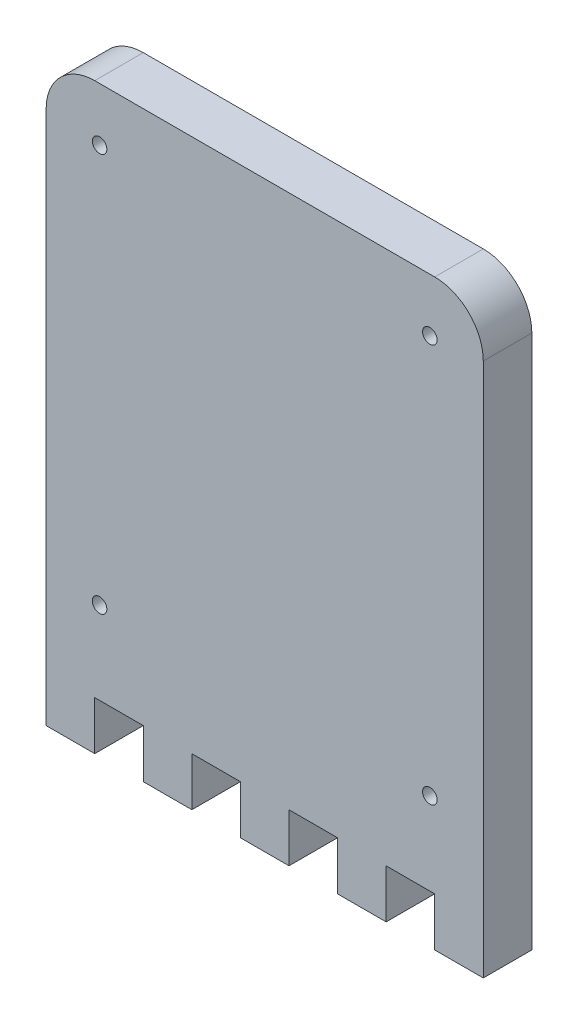
ISO-10303-21;
HEADER;
FILE_DESCRIPTION(('STEP AP214'),'2;1');
FILE_NAME('part.step','',(''),(''),'','','');
FILE_SCHEMA(('AUTOMOTIVE_DESIGN { 1 0 10303 214 1 1 1 1 }'));
ENDSEC;
DATA;
#1=APPLICATION_CONTEXT('core data for automotive mechanical design processes');
#2=APPLICATION_PROTOCOL_DEFINITION('international standard','automotive_design',2000,#1);
#3=PRODUCT_CONTEXT('',#1,'mechanical');
#4=PRODUCT('Part','Part','',(#3));
#5=PRODUCT_RELATED_PRODUCT_CATEGORY('part','',(#4));
#6=PRODUCT_DEFINITION_FORMATION('','',#4);
#7=PRODUCT_DEFINITION_CONTEXT('part definition',#1,'design');
#8=PRODUCT_DEFINITION('design','',#6,#7);
#9=PRODUCT_DEFINITION_SHAPE('','',#8);
#10=(LENGTH_UNIT() NAMED_UNIT(*) SI_UNIT(.MILLI.,.METRE.));
#11=(NAMED_UNIT(*) PLANE_ANGLE_UNIT() SI_UNIT($,.RADIAN.));
#12=(NAMED_UNIT(*) SI_UNIT($,.STERADIAN.) SOLID_ANGLE_UNIT());
#13=UNCERTAINTY_MEASURE_WITH_UNIT(LENGTH_MEASURE(1.E-05),#10,'distance_accuracy_value','');
#14=(GEOMETRIC_REPRESENTATION_CONTEXT(3) GLOBAL_UNCERTAINTY_ASSIGNED_CONTEXT((#13)) GLOBAL_UNIT_ASSIGNED_CONTEXT((#10,
#11,#12)) REPRESENTATION_CONTEXT('',''));
#15=CARTESIAN_POINT('',(0.,0.,0.));
#16=DIRECTION('',(0.,0.,1.));
#17=DIRECTION('',(1.,0.,0.));
#18=AXIS2_PLACEMENT_3D('',#15,#16,#17);
#19=CARTESIAN_POINT('',(45.,-55.,5.));
#20=DIRECTION('',(-1.,0.,0.));
#21=DIRECTION('',(0.,-1.,0.));
#22=AXIS2_PLACEMENT_3D('',#19,#20,#21);
#23=PLANE('',#22);
#24=DIRECTION('',(0.,1.,0.));
#25=VECTOR('',#24,1.);
#26=CARTESIAN_POINT('',(45.,-55.,-5.));
#27=LINE('',#26,#25);
#28=CARTESIAN_POINT('',(44.9999999999999,-65.,-5.));
#29=VERTEX_POINT('',#28);
#30=CARTESIAN_POINT('',(45.,45.,-5.));
#31=VERTEX_POINT('',#30);
#32=EDGE_CURVE('E134',#29,#31,#27,.T.);
#33=ORIENTED_EDGE('',*,*,#32,.T.);
#34=DIRECTION('',(0.,0.,-1.));
#35=VECTOR('',#34,1.);
#36=CARTESIAN_POINT('',(45.,45.,5.));
#37=LINE('',#36,#35);
#38=CARTESIAN_POINT('',(45.,45.,5.));
#39=VERTEX_POINT('',#38);
#40=EDGE_CURVE('E11',#39,#31,#37,.T.);
#41=ORIENTED_EDGE('',*,*,#40,.F.);
#42=DIRECTION('',(0.,1.,0.));
#43=VECTOR('',#42,1.);
#44=CARTESIAN_POINT('',(45.,-55.,5.));
#45=LINE('',#44,#43);
#46=CARTESIAN_POINT('',(44.9999999999999,-65.,5.));
#47=VERTEX_POINT('',#46);
#48=EDGE_CURVE('E140',#47,#39,#45,.T.);
#49=ORIENTED_EDGE('',*,*,#48,.F.);
#50=DIRECTION('',(0.,0.,-1.));
#51=VECTOR('',#50,1.);
#52=CARTESIAN_POINT('',(44.9999999999999,-65.,5.));
#53=LINE('',#52,#51);
#54=EDGE_CURVE('E220',#47,#29,#53,.T.);
#55=ORIENTED_EDGE('',*,*,#54,.T.);
#56=EDGE_LOOP('',(#33,#41,#49,#55));
#57=FACE_BOUND('',#56,.T.);
#58=ADVANCED_FACE('F39',(#57),#23,.F.);
#59=CARTESIAN_POINT('',(35.,45.,5.));
#60=DIRECTION('',(0.,0.,-1.));
#61=DIRECTION('',(-1.,0.,0.));
#62=AXIS2_PLACEMENT_3D('',#59,#60,#61);
#63=CYLINDRICAL_SURFACE('',#62,9.99999999999999);
#64=CARTESIAN_POINT('',(35.,45.,-5.));
#65=DIRECTION('',(0.,0.,1.));
#66=DIRECTION('',(1.,0.,0.));
#67=AXIS2_PLACEMENT_3D('',#64,#65,#66);
#68=CIRCLE('',#67,9.99999999999999);
#69=CARTESIAN_POINT('',(35.,55.,-5.));
#70=VERTEX_POINT('',#69);
#71=EDGE_CURVE('E226',#31,#70,#68,.T.);
#72=ORIENTED_EDGE('',*,*,#71,.T.);
#73=DIRECTION('',(0.,0.,-1.));
#74=VECTOR('',#73,1.);
#75=CARTESIAN_POINT('',(35.,55.,5.));
#76=LINE('',#75,#74);
#77=CARTESIAN_POINT('',(35.,55.,5.));
#78=VERTEX_POINT('',#77);
#79=EDGE_CURVE('E48',#78,#70,#76,.T.);
#80=ORIENTED_EDGE('',*,*,#79,.F.);
#81=CARTESIAN_POINT('',(35.,45.,5.));
#82=DIRECTION('',(0.,0.,1.));
#83=DIRECTION('',(1.,0.,0.));
#84=AXIS2_PLACEMENT_3D('',#81,#82,#83);
#85=CIRCLE('',#84,9.99999999999999);
#86=EDGE_CURVE('E443',#39,#78,#85,.T.);
#87=ORIENTED_EDGE('',*,*,#86,.F.);
#88=ORIENTED_EDGE('',*,*,#40,.T.);
#89=EDGE_LOOP('',(#72,#80,#87,#88));
#90=FACE_BOUND('',#89,.T.);
#91=ADVANCED_FACE('F450',(#90),#63,.T.);
#92=CARTESIAN_POINT('',(35.,55.,5.));
#93=DIRECTION('',(0.,-1.,0.));
#94=DIRECTION('',(1.,0.,0.));
#95=AXIS2_PLACEMENT_3D('',#92,#93,#94);
#96=PLANE('',#95);
#97=DIRECTION('',(-1.,0.,0.));
#98=VECTOR('',#97,1.);
#99=CARTESIAN_POINT('',(35.,55.,-5.));
#100=LINE('',#99,#98);
#101=CARTESIAN_POINT('',(-35.,55.,-5.));
#102=VERTEX_POINT('',#101);
#103=EDGE_CURVE('E230',#70,#102,#100,.T.);
#104=ORIENTED_EDGE('',*,*,#103,.T.);
#105=DIRECTION('',(0.,0.,-1.));
#106=VECTOR('',#105,1.);
#107=CARTESIAN_POINT('',(-35.,55.,5.));
#108=LINE('',#107,#106);
#109=CARTESIAN_POINT('',(-35.,55.,5.));
#110=VERTEX_POINT('',#109);
#111=EDGE_CURVE('E356',#110,#102,#108,.T.);
#112=ORIENTED_EDGE('',*,*,#111,.F.);
#113=DIRECTION('',(-1.,0.,0.));
#114=VECTOR('',#113,1.);
#115=CARTESIAN_POINT('',(35.,55.,5.));
#116=LINE('',#115,#114);
#117=EDGE_CURVE('E367',#78,#110,#116,.T.);
#118=ORIENTED_EDGE('',*,*,#117,.F.);
#119=ORIENTED_EDGE('',*,*,#79,.T.);
#120=EDGE_LOOP('',(#104,#112,#118,#119));
#121=FACE_BOUND('',#120,.T.);
#122=ADVANCED_FACE('F365',(#121),#96,.F.);
#123=CARTESIAN_POINT('',(-35.,45.,5.));
#124=DIRECTION('',(0.,0.,-1.));
#125=DIRECTION('',(-1.,0.,0.));
#126=AXIS2_PLACEMENT_3D('',#123,#124,#125);
#127=CYLINDRICAL_SURFACE('',#126,10.);
#128=CARTESIAN_POINT('',(-35.,45.,-5.));
#129=DIRECTION('',(0.,0.,1.));
#130=DIRECTION('',(1.,0.,0.));
#131=AXIS2_PLACEMENT_3D('',#128,#129,#130);
#132=CIRCLE('',#131,10.);
#133=CARTESIAN_POINT('',(-45.,45.,-5.));
#134=VERTEX_POINT('',#133);
#135=EDGE_CURVE('E233',#102,#134,#132,.T.);
#136=ORIENTED_EDGE('',*,*,#135,.T.);
#137=DIRECTION('',(0.,0.,-1.));
#138=VECTOR('',#137,1.);
#139=CARTESIAN_POINT('',(-45.,45.,5.));
#140=LINE('',#139,#138);
#141=CARTESIAN_POINT('',(-45.,45.,5.));
#142=VERTEX_POINT('',#141);
#143=EDGE_CURVE('E352',#142,#134,#140,.T.);
#144=ORIENTED_EDGE('',*,*,#143,.F.);
#145=CARTESIAN_POINT('',(-35.,45.,5.));
#146=DIRECTION('',(0.,0.,1.));
#147=DIRECTION('',(1.,0.,0.));
#148=AXIS2_PLACEMENT_3D('',#145,#146,#147);
#149=CIRCLE('',#148,10.);
#150=EDGE_CURVE('E385',#110,#142,#149,.T.);
#151=ORIENTED_EDGE('',*,*,#150,.F.);
#152=ORIENTED_EDGE('',*,*,#111,.T.);
#153=EDGE_LOOP('',(#136,#144,#151,#152));
#154=FACE_BOUND('',#153,.T.);
#155=ADVANCED_FACE('F375',(#154),#127,.T.);
#156=CARTESIAN_POINT('',(-45.,-55.,5.));
#157=DIRECTION('',(1.,0.,0.));
#158=DIRECTION('',(0.,0.,-1.));
#159=AXIS2_PLACEMENT_3D('',#156,#157,#158);
#160=PLANE('',#159);
#161=DIRECTION('',(0.,-1.,0.));
#162=VECTOR('',#161,1.);
#163=CARTESIAN_POINT('',(-45.,-55.,-5.));
#164=LINE('',#163,#162);
#165=CARTESIAN_POINT('',(-45.,-65.,-5.));
#166=VERTEX_POINT('',#165);
#167=EDGE_CURVE('E237',#134,#166,#164,.T.);
#168=ORIENTED_EDGE('',*,*,#167,.T.);
#169=DIRECTION('',(0.,0.,-1.));
#170=VECTOR('',#169,1.);
#171=CARTESIAN_POINT('',(-45.,-65.,5.));
#172=LINE('',#171,#170);
#173=CARTESIAN_POINT('',(-45.,-65.,5.));
#174=VERTEX_POINT('',#173);
#175=EDGE_CURVE('E348',#174,#166,#172,.T.);
#176=ORIENTED_EDGE('',*,*,#175,.F.);
#177=DIRECTION('',(0.,-1.,0.));
#178=VECTOR('',#177,1.);
#179=CARTESIAN_POINT('',(-45.,-55.,5.));
#180=LINE('',#179,#178);
#181=EDGE_CURVE('E381',#142,#174,#180,.T.);
#182=ORIENTED_EDGE('',*,*,#181,.F.);
#183=ORIENTED_EDGE('',*,*,#143,.T.);
#184=EDGE_LOOP('',(#168,#176,#182,#183));
#185=FACE_BOUND('',#184,.T.);
#186=ADVANCED_FACE('F379',(#185),#160,.F.);
#187=CARTESIAN_POINT('',(-45.,-65.,5.));
#188=DIRECTION('',(0.,1.,0.));
#189=DIRECTION('',(0.,0.,1.));
#190=AXIS2_PLACEMENT_3D('',#187,#188,#189);
#191=PLANE('',#190);
#192=DIRECTION('',(1.,0.,0.));
#193=VECTOR('',#192,1.);
#194=CARTESIAN_POINT('',(-45.,-65.,-5.));
#195=LINE('',#194,#193);
#196=CARTESIAN_POINT('',(-35.,-65.,-5.));
#197=VERTEX_POINT('',#196);
#198=EDGE_CURVE('E240',#166,#197,#195,.T.);
#199=ORIENTED_EDGE('',*,*,#198,.T.);
#200=DIRECTION('',(0.,0.,-1.));
#201=VECTOR('',#200,1.);
#202=CARTESIAN_POINT('',(-35.,-65.,5.));
#203=LINE('',#202,#201);
#204=CARTESIAN_POINT('',(-35.,-65.,5.));
#205=VERTEX_POINT('',#204);
#206=EDGE_CURVE('E344',#205,#197,#203,.T.);
#207=ORIENTED_EDGE('',*,*,#206,.F.);
#208=DIRECTION('',(1.,0.,0.));
#209=VECTOR('',#208,1.);
#210=CARTESIAN_POINT('',(-45.,-65.,5.));
#211=LINE('',#210,#209);
#212=EDGE_CURVE('E384',#174,#205,#211,.T.);
#213=ORIENTED_EDGE('',*,*,#212,.F.);
#214=ORIENTED_EDGE('',*,*,#175,.T.);
#215=EDGE_LOOP('',(#199,#207,#213,#214));
#216=FACE_BOUND('',#215,.T.);
#217=ADVANCED_FACE('F462',(#216),#191,.F.);
#218=CARTESIAN_POINT('',(-35.,-55.,5.));
#219=DIRECTION('',(-1.,0.,0.));
#220=DIRECTION('',(0.,0.,1.));
#221=AXIS2_PLACEMENT_3D('',#218,#219,#220);
#222=PLANE('',#221);
#223=DIRECTION('',(0.,1.,0.));
#224=VECTOR('',#223,1.);
#225=CARTESIAN_POINT('',(-35.,-55.,-5.));
#226=LINE('',#225,#224);
#227=CARTESIAN_POINT('',(-35.,-55.,-5.));
#228=VERTEX_POINT('',#227);
#229=EDGE_CURVE('E243',#197,#228,#226,.T.);
#230=ORIENTED_EDGE('',*,*,#229,.T.);
#231=DIRECTION('',(0.,0.,-1.));
#232=VECTOR('',#231,1.);
#233=CARTESIAN_POINT('',(-35.,-55.,5.));
#234=LINE('',#233,#232);
#235=CARTESIAN_POINT('',(-35.,-55.,5.));
#236=VERTEX_POINT('',#235);
#237=EDGE_CURVE('E340',#236,#228,#234,.T.);
#238=ORIENTED_EDGE('',*,*,#237,.F.);
#239=DIRECTION('',(0.,1.,0.));
#240=VECTOR('',#239,1.);
#241=CARTESIAN_POINT('',(-35.,-55.,5.));
#242=LINE('',#241,#240);
#243=EDGE_CURVE('E389',#205,#236,#242,.T.);
#244=ORIENTED_EDGE('',*,*,#243,.F.);
#245=ORIENTED_EDGE('',*,*,#206,.T.);
#246=EDGE_LOOP('',(#230,#238,#244,#245));
#247=FACE_BOUND('',#246,.T.);
#248=ADVANCED_FACE('F465',(#247),#222,.F.);
#249=CARTESIAN_POINT('',(-25.,-55.,5.));
#250=DIRECTION('',(0.,1.,0.));
#251=DIRECTION('',(-1.,0.,0.));
#252=AXIS2_PLACEMENT_3D('',#249,#250,#251);
#253=PLANE('',#252);
#254=DIRECTION('',(1.,0.,0.));
#255=VECTOR('',#254,1.);
#256=CARTESIAN_POINT('',(-25.,-55.,-5.));
#257=LINE('',#256,#255);
#258=CARTESIAN_POINT('',(-25.,-55.,-5.));
#259=VERTEX_POINT('',#258);
#260=EDGE_CURVE('E246',#228,#259,#257,.T.);
#261=ORIENTED_EDGE('',*,*,#260,.T.);
#262=DIRECTION('',(0.,0.,-1.));
#263=VECTOR('',#262,1.);
#264=CARTESIAN_POINT('',(-25.,-55.,5.));
#265=LINE('',#264,#263);
#266=CARTESIAN_POINT('',(-25.,-55.,5.));
#267=VERTEX_POINT('',#266);
#268=EDGE_CURVE('E336',#267,#259,#265,.T.);
#269=ORIENTED_EDGE('',*,*,#268,.F.);
#270=DIRECTION('',(1.,0.,0.));
#271=VECTOR('',#270,1.);
#272=CARTESIAN_POINT('',(-25.,-55.,5.));
#273=LINE('',#272,#271);
#274=EDGE_CURVE('E396',#236,#267,#273,.T.);
#275=ORIENTED_EDGE('',*,*,#274,.F.);
#276=ORIENTED_EDGE('',*,*,#237,.T.);
#277=EDGE_LOOP('',(#261,#269,#275,#276));
#278=FACE_BOUND('',#277,.T.);
#279=ADVANCED_FACE('F469',(#278),#253,.F.);
#280=CARTESIAN_POINT('',(-25.,-55.,5.));
#281=DIRECTION('',(1.,0.,0.));
#282=DIRECTION('',(0.,1.,0.));
#283=AXIS2_PLACEMENT_3D('',#280,#281,#282);
#284=PLANE('',#283);
#285=DIRECTION('',(0.,-1.,0.));
#286=VECTOR('',#285,1.);
#287=CARTESIAN_POINT('',(-25.,-55.,-5.));
#288=LINE('',#287,#286);
#289=CARTESIAN_POINT('',(-25.,-65.,-5.));
#290=VERTEX_POINT('',#289);
#291=EDGE_CURVE('E249',#259,#290,#288,.T.);
#292=ORIENTED_EDGE('',*,*,#291,.T.);
#293=DIRECTION('',(0.,0.,-1.));
#294=VECTOR('',#293,1.);
#295=CARTESIAN_POINT('',(-25.,-65.,5.));
#296=LINE('',#295,#294);
#297=CARTESIAN_POINT('',(-25.,-65.,5.));
#298=VERTEX_POINT('',#297);
#299=EDGE_CURVE('E332',#298,#290,#296,.T.);
#300=ORIENTED_EDGE('',*,*,#299,.F.);
#301=DIRECTION('',(0.,-1.,0.));
#302=VECTOR('',#301,1.);
#303=CARTESIAN_POINT('',(-25.,-55.,5.));
#304=LINE('',#303,#302);
#305=EDGE_CURVE('E399',#267,#298,#304,.T.);
#306=ORIENTED_EDGE('',*,*,#305,.F.);
#307=ORIENTED_EDGE('',*,*,#268,.T.);
#308=EDGE_LOOP('',(#292,#300,#306,#307));
#309=FACE_BOUND('',#308,.T.);
#310=ADVANCED_FACE('F473',(#309),#284,.F.);
#311=CARTESIAN_POINT('',(-25.,-65.,5.));
#312=DIRECTION('',(0.,1.,0.));
#313=DIRECTION('',(0.,0.,1.));
#314=AXIS2_PLACEMENT_3D('',#311,#312,#313);
#315=PLANE('',#314);
#316=DIRECTION('',(1.,0.,0.));
#317=VECTOR('',#316,1.);
#318=CARTESIAN_POINT('',(-25.,-65.,-5.));
#319=LINE('',#318,#317);
#320=CARTESIAN_POINT('',(-15.,-65.,-5.));
#321=VERTEX_POINT('',#320);
#322=EDGE_CURVE('E252',#290,#321,#319,.T.);
#323=ORIENTED_EDGE('',*,*,#322,.T.);
#324=DIRECTION('',(0.,0.,-1.));
#325=VECTOR('',#324,1.);
#326=CARTESIAN_POINT('',(-15.,-65.,5.));
#327=LINE('',#326,#325);
#328=CARTESIAN_POINT('',(-15.,-65.,5.));
#329=VERTEX_POINT('',#328);
#330=EDGE_CURVE('E328',#329,#321,#327,.T.);
#331=ORIENTED_EDGE('',*,*,#330,.F.);
#332=DIRECTION('',(1.,0.,0.));
#333=VECTOR('',#332,1.);
#334=CARTESIAN_POINT('',(-25.,-65.,5.));
#335=LINE('',#334,#333);
#336=EDGE_CURVE('E402',#298,#329,#335,.T.);
#337=ORIENTED_EDGE('',*,*,#336,.F.);
#338=ORIENTED_EDGE('',*,*,#299,.T.);
#339=EDGE_LOOP('',(#323,#331,#337,#338));
#340=FACE_BOUND('',#339,.T.);
#341=ADVANCED_FACE('F477',(#340),#315,.F.);
#342=CARTESIAN_POINT('',(-15.,-55.,5.));
#343=DIRECTION('',(-1.,0.,0.));
#344=DIRECTION('',(0.,-1.,0.));
#345=AXIS2_PLACEMENT_3D('',#342,#343,#344);
#346=PLANE('',#345);
#347=DIRECTION('',(0.,1.,0.));
#348=VECTOR('',#347,1.);
#349=CARTESIAN_POINT('',(-15.,-55.,-5.));
#350=LINE('',#349,#348);
#351=CARTESIAN_POINT('',(-15.,-55.,-5.));
#352=VERTEX_POINT('',#351);
#353=EDGE_CURVE('E255',#321,#352,#350,.T.);
#354=ORIENTED_EDGE('',*,*,#353,.T.);
#355=DIRECTION('',(0.,0.,-1.));
#356=VECTOR('',#355,1.);
#357=CARTESIAN_POINT('',(-15.,-55.,5.));
#358=LINE('',#357,#356);
#359=CARTESIAN_POINT('',(-15.,-55.,5.));
#360=VERTEX_POINT('',#359);
#361=EDGE_CURVE('E324',#360,#352,#358,.T.);
#362=ORIENTED_EDGE('',*,*,#361,.F.);
#363=DIRECTION('',(0.,1.,0.));
#364=VECTOR('',#363,1.);
#365=CARTESIAN_POINT('',(-15.,-55.,5.));
#366=LINE('',#365,#364);
#367=EDGE_CURVE('E405',#329,#360,#366,.T.);
#368=ORIENTED_EDGE('',*,*,#367,.F.);
#369=ORIENTED_EDGE('',*,*,#330,.T.);
#370=EDGE_LOOP('',(#354,#362,#368,#369));
#371=FACE_BOUND('',#370,.T.);
#372=ADVANCED_FACE('F481',(#371),#346,.F.);
#373=CARTESIAN_POINT('',(-5.00000000000004,-55.,5.));
#374=DIRECTION('',(0.,1.,0.));
#375=DIRECTION('',(-1.,0.,0.));
#376=AXIS2_PLACEMENT_3D('',#373,#374,#375);
#377=PLANE('',#376);
#378=DIRECTION('',(1.,0.,0.));
#379=VECTOR('',#378,1.);
#380=CARTESIAN_POINT('',(-5.00000000000004,-55.,-5.));
#381=LINE('',#380,#379);
#382=CARTESIAN_POINT('',(-5.00000000000004,-55.,-5.));
#383=VERTEX_POINT('',#382);
#384=EDGE_CURVE('E258',#352,#383,#381,.T.);
#385=ORIENTED_EDGE('',*,*,#384,.T.);
#386=DIRECTION('',(0.,0.,-1.));
#387=VECTOR('',#386,1.);
#388=CARTESIAN_POINT('',(-5.00000000000004,-55.,5.));
#389=LINE('',#388,#387);
#390=CARTESIAN_POINT('',(-5.00000000000004,-55.,5.));
#391=VERTEX_POINT('',#390);
#392=EDGE_CURVE('E320',#391,#383,#389,.T.);
#393=ORIENTED_EDGE('',*,*,#392,.F.);
#394=DIRECTION('',(1.,0.,0.));
#395=VECTOR('',#394,1.);
#396=CARTESIAN_POINT('',(-5.00000000000004,-55.,5.));
#397=LINE('',#396,#395);
#398=EDGE_CURVE('E408',#360,#391,#397,.T.);
#399=ORIENTED_EDGE('',*,*,#398,.F.);
#400=ORIENTED_EDGE('',*,*,#361,.T.);
#401=EDGE_LOOP('',(#385,#393,#399,#400));
#402=FACE_BOUND('',#401,.T.);
#403=ADVANCED_FACE('F485',(#402),#377,.F.);
#404=CARTESIAN_POINT('',(-5.00000000000004,-55.,5.));
#405=DIRECTION('',(1.,0.,0.));
#406=DIRECTION('',(0.,1.,0.));
#407=AXIS2_PLACEMENT_3D('',#404,#405,#406);
#408=PLANE('',#407);
#409=DIRECTION('',(0.,-1.,0.));
#410=VECTOR('',#409,1.);
#411=CARTESIAN_POINT('',(-5.00000000000004,-55.,-5.));
#412=LINE('',#411,#410);
#413=CARTESIAN_POINT('',(-5.00000000000003,-65.,-5.));
#414=VERTEX_POINT('',#413);
#415=EDGE_CURVE('E261',#383,#414,#412,.T.);
#416=ORIENTED_EDGE('',*,*,#415,.T.);
#417=DIRECTION('',(0.,0.,-1.));
#418=VECTOR('',#417,1.);
#419=CARTESIAN_POINT('',(-5.00000000000003,-65.,5.));
#420=LINE('',#419,#418);
#421=CARTESIAN_POINT('',(-5.00000000000003,-65.,5.));
#422=VERTEX_POINT('',#421);
#423=EDGE_CURVE('E316',#422,#414,#420,.T.);
#424=ORIENTED_EDGE('',*,*,#423,.F.);
#425=DIRECTION('',(0.,-1.,0.));
#426=VECTOR('',#425,1.);
#427=CARTESIAN_POINT('',(-5.00000000000004,-55.,5.));
#428=LINE('',#427,#426);
#429=EDGE_CURVE('E411',#391,#422,#428,.T.);
#430=ORIENTED_EDGE('',*,*,#429,.F.);
#431=ORIENTED_EDGE('',*,*,#392,.T.);
#432=EDGE_LOOP('',(#416,#424,#430,#431));
#433=FACE_BOUND('',#432,.T.);
#434=ADVANCED_FACE('F489',(#433),#408,.F.);
#435=CARTESIAN_POINT('',(-5.00000000000003,-65.,5.));
#436=DIRECTION('',(0.,1.,0.));
#437=DIRECTION('',(0.,0.,1.));
#438=AXIS2_PLACEMENT_3D('',#435,#436,#437);
#439=PLANE('',#438);
#440=DIRECTION('',(1.,0.,0.));
#441=VECTOR('',#440,1.);
#442=CARTESIAN_POINT('',(-5.00000000000003,-65.,-5.));
#443=LINE('',#442,#441);
#444=CARTESIAN_POINT('',(4.99999999999997,-65.,-5.));
#445=VERTEX_POINT('',#444);
#446=EDGE_CURVE('E264',#414,#445,#443,.T.);
#447=ORIENTED_EDGE('',*,*,#446,.T.);
#448=DIRECTION('',(0.,0.,-1.));
#449=VECTOR('',#448,1.);
#450=CARTESIAN_POINT('',(4.99999999999997,-65.,5.));
#451=LINE('',#450,#449);
#452=CARTESIAN_POINT('',(4.99999999999997,-65.,5.));
#453=VERTEX_POINT('',#452);
#454=EDGE_CURVE('E312',#453,#445,#451,.T.);
#455=ORIENTED_EDGE('',*,*,#454,.F.);
#456=DIRECTION('',(1.,0.,0.));
#457=VECTOR('',#456,1.);
#458=CARTESIAN_POINT('',(-5.00000000000003,-65.,5.));
#459=LINE('',#458,#457);
#460=EDGE_CURVE('E414',#422,#453,#459,.T.);
#461=ORIENTED_EDGE('',*,*,#460,.F.);
#462=ORIENTED_EDGE('',*,*,#423,.T.);
#463=EDGE_LOOP('',(#447,#455,#461,#462));
#464=FACE_BOUND('',#463,.T.);
#465=ADVANCED_FACE('F493',(#464),#439,.F.);
#466=CARTESIAN_POINT('',(4.99999999999996,-55.,5.));
#467=DIRECTION('',(-1.,0.,0.));
#468=DIRECTION('',(0.,-1.,0.));
#469=AXIS2_PLACEMENT_3D('',#466,#467,#468);
#470=PLANE('',#469);
#471=DIRECTION('',(0.,1.,0.));
#472=VECTOR('',#471,1.);
#473=CARTESIAN_POINT('',(4.99999999999996,-55.,-5.));
#474=LINE('',#473,#472);
#475=CARTESIAN_POINT('',(4.99999999999996,-55.,-5.));
#476=VERTEX_POINT('',#475);
#477=EDGE_CURVE('E267',#445,#476,#474,.T.);
#478=ORIENTED_EDGE('',*,*,#477,.T.);
#479=DIRECTION('',(0.,0.,-1.));
#480=VECTOR('',#479,1.);
#481=CARTESIAN_POINT('',(4.99999999999996,-55.,5.));
#482=LINE('',#481,#480);
#483=CARTESIAN_POINT('',(4.99999999999996,-55.,5.));
#484=VERTEX_POINT('',#483);
#485=EDGE_CURVE('E308',#484,#476,#482,.T.);
#486=ORIENTED_EDGE('',*,*,#485,.F.);
#487=DIRECTION('',(0.,1.,0.));
#488=VECTOR('',#487,1.);
#489=CARTESIAN_POINT('',(4.99999999999996,-55.,5.));
#490=LINE('',#489,#488);
#491=EDGE_CURVE('E417',#453,#484,#490,.T.);
#492=ORIENTED_EDGE('',*,*,#491,.F.);
#493=ORIENTED_EDGE('',*,*,#454,.T.);
#494=EDGE_LOOP('',(#478,#486,#492,#493));
#495=FACE_BOUND('',#494,.T.);
#496=ADVANCED_FACE('F497',(#495),#470,.F.);
#497=CARTESIAN_POINT('',(14.9999999999999,-55.,5.));
#498=DIRECTION('',(0.,1.,0.));
#499=DIRECTION('',(-1.,0.,0.));
#500=AXIS2_PLACEMENT_3D('',#497,#498,#499);
#501=PLANE('',#500);
#502=DIRECTION('',(1.,0.,0.));
#503=VECTOR('',#502,1.);
#504=CARTESIAN_POINT('',(14.9999999999999,-55.,-5.));
#505=LINE('',#504,#503);
#506=CARTESIAN_POINT('',(14.9999999999999,-55.,-5.));
#507=VERTEX_POINT('',#506);
#508=EDGE_CURVE('E270',#476,#507,#505,.T.);
#509=ORIENTED_EDGE('',*,*,#508,.T.);
#510=DIRECTION('',(0.,0.,-1.));
#511=VECTOR('',#510,1.);
#512=CARTESIAN_POINT('',(14.9999999999999,-55.,5.));
#513=LINE('',#512,#511);
#514=CARTESIAN_POINT('',(14.9999999999999,-55.,5.));
#515=VERTEX_POINT('',#514);
#516=EDGE_CURVE('E304',#515,#507,#513,.T.);
#517=ORIENTED_EDGE('',*,*,#516,.F.);
#518=DIRECTION('',(1.,0.,0.));
#519=VECTOR('',#518,1.);
#520=CARTESIAN_POINT('',(14.9999999999999,-55.,5.));
#521=LINE('',#520,#519);
#522=EDGE_CURVE('E420',#484,#515,#521,.T.);
#523=ORIENTED_EDGE('',*,*,#522,.F.);
#524=ORIENTED_EDGE('',*,*,#485,.T.);
#525=EDGE_LOOP('',(#509,#517,#523,#524));
#526=FACE_BOUND('',#525,.T.);
#527=ADVANCED_FACE('F501',(#526),#501,.F.);
#528=CARTESIAN_POINT('',(14.9999999999999,-55.,5.));
#529=DIRECTION('',(1.,0.,0.));
#530=DIRECTION('',(0.,1.,0.));
#531=AXIS2_PLACEMENT_3D('',#528,#529,#530);
#532=PLANE('',#531);
#533=DIRECTION('',(0.,-1.,0.));
#534=VECTOR('',#533,1.);
#535=CARTESIAN_POINT('',(14.9999999999999,-55.,-5.));
#536=LINE('',#535,#534);
#537=CARTESIAN_POINT('',(15.,-65.,-5.));
#538=VERTEX_POINT('',#537);
#539=EDGE_CURVE('E273',#507,#538,#536,.T.);
#540=ORIENTED_EDGE('',*,*,#539,.T.);
#541=DIRECTION('',(0.,0.,-1.));
#542=VECTOR('',#541,1.);
#543=CARTESIAN_POINT('',(15.,-65.,5.));
#544=LINE('',#543,#542);
#545=CARTESIAN_POINT('',(15.,-65.,5.));
#546=VERTEX_POINT('',#545);
#547=EDGE_CURVE('E300',#546,#538,#544,.T.);
#548=ORIENTED_EDGE('',*,*,#547,.F.);
#549=DIRECTION('',(0.,-1.,0.));
#550=VECTOR('',#549,1.);
#551=CARTESIAN_POINT('',(14.9999999999999,-55.,5.));
#552=LINE('',#551,#550);
#553=EDGE_CURVE('E423',#515,#546,#552,.T.);
#554=ORIENTED_EDGE('',*,*,#553,.F.);
#555=ORIENTED_EDGE('',*,*,#516,.T.);
#556=EDGE_LOOP('',(#540,#548,#554,#555));
#557=FACE_BOUND('',#556,.T.);
#558=ADVANCED_FACE('F505',(#557),#532,.F.);
#559=CARTESIAN_POINT('',(15.,-65.,5.));
#560=DIRECTION('',(0.,1.,0.));
#561=DIRECTION('',(0.,0.,1.));
#562=AXIS2_PLACEMENT_3D('',#559,#560,#561);
#563=PLANE('',#562);
#564=DIRECTION('',(1.,0.,0.));
#565=VECTOR('',#564,1.);
#566=CARTESIAN_POINT('',(15.,-65.,-5.));
#567=LINE('',#566,#565);
#568=CARTESIAN_POINT('',(25.,-65.,-5.));
#569=VERTEX_POINT('',#568);
#570=EDGE_CURVE('E276',#538,#569,#567,.T.);
#571=ORIENTED_EDGE('',*,*,#570,.T.);
#572=DIRECTION('',(0.,0.,-1.));
#573=VECTOR('',#572,1.);
#574=CARTESIAN_POINT('',(25.,-65.,5.));
#575=LINE('',#574,#573);
#576=CARTESIAN_POINT('',(25.,-65.,5.));
#577=VERTEX_POINT('',#576);
#578=EDGE_CURVE('E296',#577,#569,#575,.T.);
#579=ORIENTED_EDGE('',*,*,#578,.F.);
#580=DIRECTION('',(1.,0.,0.));
#581=VECTOR('',#580,1.);
#582=CARTESIAN_POINT('',(15.,-65.,5.));
#583=LINE('',#582,#581);
#584=EDGE_CURVE('E426',#546,#577,#583,.T.);
#585=ORIENTED_EDGE('',*,*,#584,.F.);
#586=ORIENTED_EDGE('',*,*,#547,.T.);
#587=EDGE_LOOP('',(#571,#579,#585,#586));
#588=FACE_BOUND('',#587,.T.);
#589=ADVANCED_FACE('F434',(#588),#563,.F.);
#590=CARTESIAN_POINT('',(24.9999999999999,-55.,5.));
#591=DIRECTION('',(-1.,0.,0.));
#592=DIRECTION('',(0.,-1.,0.));
#593=AXIS2_PLACEMENT_3D('',#590,#591,#592);
#594=PLANE('',#593);
#595=DIRECTION('',(0.,1.,0.));
#596=VECTOR('',#595,1.);
#597=CARTESIAN_POINT('',(24.9999999999999,-55.,-5.));
#598=LINE('',#597,#596);
#599=CARTESIAN_POINT('',(24.9999999999999,-55.,-5.));
#600=VERTEX_POINT('',#599);
#601=EDGE_CURVE('E279',#569,#600,#598,.T.);
#602=ORIENTED_EDGE('',*,*,#601,.T.);
#603=DIRECTION('',(0.,0.,-1.));
#604=VECTOR('',#603,1.);
#605=CARTESIAN_POINT('',(24.9999999999999,-55.,5.));
#606=LINE('',#605,#604);
#607=CARTESIAN_POINT('',(24.9999999999999,-55.,5.));
#608=VERTEX_POINT('',#607);
#609=EDGE_CURVE('E213',#608,#600,#606,.T.);
#610=ORIENTED_EDGE('',*,*,#609,.F.);
#611=DIRECTION('',(0.,1.,0.));
#612=VECTOR('',#611,1.);
#613=CARTESIAN_POINT('',(24.9999999999999,-55.,5.));
#614=LINE('',#613,#612);
#615=EDGE_CURVE('E202',#577,#608,#614,.T.);
#616=ORIENTED_EDGE('',*,*,#615,.F.);
#617=ORIENTED_EDGE('',*,*,#578,.T.);
#618=EDGE_LOOP('',(#602,#610,#616,#617));
#619=FACE_BOUND('',#618,.T.);
#620=ADVANCED_FACE('F438',(#619),#594,.F.);
#621=CARTESIAN_POINT('',(34.9999999999999,-55.,5.));
#622=DIRECTION('',(0.,1.,0.));
#623=DIRECTION('',(-1.,0.,0.));
#624=AXIS2_PLACEMENT_3D('',#621,#622,#623);
#625=PLANE('',#624);
#626=DIRECTION('',(1.,0.,0.));
#627=VECTOR('',#626,1.);
#628=CARTESIAN_POINT('',(34.9999999999999,-55.,-5.));
#629=LINE('',#628,#627);
#630=CARTESIAN_POINT('',(34.9999999999999,-55.,-5.));
#631=VERTEX_POINT('',#630);
#632=EDGE_CURVE('E211',#600,#631,#629,.T.);
#633=ORIENTED_EDGE('',*,*,#632,.T.);
#634=DIRECTION('',(0.,0.,-1.));
#635=VECTOR('',#634,1.);
#636=CARTESIAN_POINT('',(34.9999999999999,-55.,5.));
#637=LINE('',#636,#635);
#638=CARTESIAN_POINT('',(34.9999999999999,-55.,5.));
#639=VERTEX_POINT('',#638);
#640=EDGE_CURVE('E208',#639,#631,#637,.T.);
#641=ORIENTED_EDGE('',*,*,#640,.F.);
#642=DIRECTION('',(1.,0.,0.));
#643=VECTOR('',#642,1.);
#644=CARTESIAN_POINT('',(34.9999999999999,-55.,5.));
#645=LINE('',#644,#643);
#646=EDGE_CURVE('E196',#608,#639,#645,.T.);
#647=ORIENTED_EDGE('',*,*,#646,.F.);
#648=ORIENTED_EDGE('',*,*,#609,.T.);
#649=EDGE_LOOP('',(#633,#641,#647,#648));
#650=FACE_BOUND('',#649,.T.);
#651=ADVANCED_FACE('F209',(#650),#625,.F.);
#652=CARTESIAN_POINT('',(34.9999999999999,-55.,5.));
#653=DIRECTION('',(1.,0.,0.));
#654=DIRECTION('',(0.,1.,0.));
#655=AXIS2_PLACEMENT_3D('',#652,#653,#654);
#656=PLANE('',#655);
#657=DIRECTION('',(0.,-1.,0.));
#658=VECTOR('',#657,1.);
#659=CARTESIAN_POINT('',(34.9999999999999,-55.,-5.));
#660=LINE('',#659,#658);
#661=CARTESIAN_POINT('',(34.9999999999999,-65.,-5.));
#662=VERTEX_POINT('',#661);
#663=EDGE_CURVE('E127',#631,#662,#660,.T.);
#664=ORIENTED_EDGE('',*,*,#663,.T.);
#665=DIRECTION('',(0.,0.,-1.));
#666=VECTOR('',#665,1.);
#667=CARTESIAN_POINT('',(34.9999999999999,-65.,5.));
#668=LINE('',#667,#666);
#669=CARTESIAN_POINT('',(34.9999999999999,-65.,5.));
#670=VERTEX_POINT('',#669);
#671=EDGE_CURVE('E214',#670,#662,#668,.T.);
#672=ORIENTED_EDGE('',*,*,#671,.F.);
#673=DIRECTION('',(0.,-1.,0.));
#674=VECTOR('',#673,1.);
#675=CARTESIAN_POINT('',(34.9999999999999,-55.,5.));
#676=LINE('',#675,#674);
#677=EDGE_CURVE('E200',#639,#670,#676,.T.);
#678=ORIENTED_EDGE('',*,*,#677,.F.);
#679=ORIENTED_EDGE('',*,*,#640,.T.);
#680=EDGE_LOOP('',(#664,#672,#678,#679));
#681=FACE_BOUND('',#680,.T.);
#682=ADVANCED_FACE('F216',(#681),#656,.F.);
#683=CARTESIAN_POINT('',(34.9999999999999,-65.,5.));
#684=DIRECTION('',(0.,1.,0.));
#685=DIRECTION('',(0.,0.,1.));
#686=AXIS2_PLACEMENT_3D('',#683,#684,#685);
#687=PLANE('',#686);
#688=DIRECTION('',(1.,0.,0.));
#689=VECTOR('',#688,1.);
#690=CARTESIAN_POINT('',(34.9999999999999,-65.,-5.));
#691=LINE('',#690,#689);
#692=EDGE_CURVE('E286',#662,#29,#691,.T.);
#693=ORIENTED_EDGE('',*,*,#692,.T.);
#694=ORIENTED_EDGE('',*,*,#54,.F.);
#695=DIRECTION('',(1.,0.,0.));
#696=VECTOR('',#695,1.);
#697=CARTESIAN_POINT('',(34.9999999999999,-65.,5.));
#698=LINE('',#697,#696);
#699=EDGE_CURVE('E56',#670,#47,#698,.T.);
#700=ORIENTED_EDGE('',*,*,#699,.F.);
#701=ORIENTED_EDGE('',*,*,#671,.T.);
#702=EDGE_LOOP('',(#693,#694,#700,#701));
#703=FACE_BOUND('',#702,.T.);
#704=ADVANCED_FACE('F440',(#703),#687,.F.);
#705=CARTESIAN_POINT('',(-35.,45.,5.));
#706=DIRECTION('',(0.,0.,1.));
#707=DIRECTION('',(1.,0.,0.));
#708=AXIS2_PLACEMENT_3D('',#705,#706,#707);
#709=PLANE('',#708);
#710=CARTESIAN_POINT('',(-34.,-38.,5.));
#711=DIRECTION('',(0.,0.,1.));
#712=DIRECTION('',(-1.,0.,0.));
#713=AXIS2_PLACEMENT_3D('',#710,#711,#712);
#714=CIRCLE('',#713,1.5);
#715=CARTESIAN_POINT('',(-35.5,-38.,5.));
#716=VERTEX_POINT('',#715);
#717=EDGE_CURVE('E566',#716,#716,#714,.T.);
#718=ORIENTED_EDGE('',*,*,#717,.F.);
#719=EDGE_LOOP('',(#718));
#720=FACE_BOUND('',#719,.T.);
#721=CARTESIAN_POINT('',(34.,-38.,5.));
#722=DIRECTION('',(0.,0.,1.));
#723=DIRECTION('',(1.,0.,0.));
#724=AXIS2_PLACEMENT_3D('',#721,#722,#723);
#725=CIRCLE('',#724,1.5);
#726=CARTESIAN_POINT('',(35.5,-38.,5.));
#727=VERTEX_POINT('',#726);
#728=EDGE_CURVE('E559',#727,#727,#725,.T.);
#729=ORIENTED_EDGE('',*,*,#728,.F.);
#730=EDGE_LOOP('',(#729));
#731=FACE_BOUND('',#730,.T.);
#732=CARTESIAN_POINT('',(34.,44.,5.));
#733=DIRECTION('',(0.,0.,1.));
#734=DIRECTION('',(-1.,0.,0.));
#735=AXIS2_PLACEMENT_3D('',#732,#733,#734);
#736=CIRCLE('',#735,1.5);
#737=CARTESIAN_POINT('',(32.5,44.,5.));
#738=VERTEX_POINT('',#737);
#739=EDGE_CURVE('E549',#738,#738,#736,.T.);
#740=ORIENTED_EDGE('',*,*,#739,.F.);
#741=EDGE_LOOP('',(#740));
#742=FACE_BOUND('',#741,.T.);
#743=CARTESIAN_POINT('',(-34.,44.,5.));
#744=DIRECTION('',(0.,0.,1.));
#745=DIRECTION('',(1.,0.,0.));
#746=AXIS2_PLACEMENT_3D('',#743,#744,#745);
#747=CIRCLE('',#746,1.5);
#748=CARTESIAN_POINT('',(-32.5,44.,5.));
#749=VERTEX_POINT('',#748);
#750=EDGE_CURVE('E556',#749,#749,#747,.T.);
#751=ORIENTED_EDGE('',*,*,#750,.F.);
#752=EDGE_LOOP('',(#751));
#753=FACE_BOUND('',#752,.T.);
#754=ORIENTED_EDGE('',*,*,#48,.T.);
#755=ORIENTED_EDGE('',*,*,#86,.T.);
#756=ORIENTED_EDGE('',*,*,#117,.T.);
#757=ORIENTED_EDGE('',*,*,#150,.T.);
#758=ORIENTED_EDGE('',*,*,#181,.T.);
#759=ORIENTED_EDGE('',*,*,#212,.T.);
#760=ORIENTED_EDGE('',*,*,#243,.T.);
#761=ORIENTED_EDGE('',*,*,#274,.T.);
#762=ORIENTED_EDGE('',*,*,#305,.T.);
#763=ORIENTED_EDGE('',*,*,#336,.T.);
#764=ORIENTED_EDGE('',*,*,#367,.T.);
#765=ORIENTED_EDGE('',*,*,#398,.T.);
#766=ORIENTED_EDGE('',*,*,#429,.T.);
#767=ORIENTED_EDGE('',*,*,#460,.T.);
#768=ORIENTED_EDGE('',*,*,#491,.T.);
#769=ORIENTED_EDGE('',*,*,#522,.T.);
#770=ORIENTED_EDGE('',*,*,#553,.T.);
#771=ORIENTED_EDGE('',*,*,#584,.T.);
#772=ORIENTED_EDGE('',*,*,#615,.T.);
#773=ORIENTED_EDGE('',*,*,#646,.T.);
#774=ORIENTED_EDGE('',*,*,#677,.T.);
#775=ORIENTED_EDGE('',*,*,#699,.T.);
#776=EDGE_LOOP('',(#754,#755,#756,#757,#758,#759,#760,#761,#762,#763,#764,#765,#766,#767,#768,
#769,#770,#771,#772,#773,#774,#775));
#777=FACE_BOUND('',#776,.T.);
#778=ADVANCED_FACE('F198',(#720,#731,#742,#753,#777),#709,.T.);
#779=CARTESIAN_POINT('',(-35.,45.,-5.));
#780=DIRECTION('',(0.,0.,1.));
#781=DIRECTION('',(1.,0.,0.));
#782=AXIS2_PLACEMENT_3D('',#779,#780,#781);
#783=PLANE('',#782);
#784=CARTESIAN_POINT('',(-34.,-38.,-5.));
#785=DIRECTION('',(0.,0.,1.));
#786=DIRECTION('',(1.,0.,0.));
#787=AXIS2_PLACEMENT_3D('',#784,#785,#786);
#788=CIRCLE('',#787,1.5);
#789=CARTESIAN_POINT('',(-32.5,-38.,-5.));
#790=VERTEX_POINT('',#789);
#791=EDGE_CURVE('E564',#790,#790,#788,.F.);
#792=ORIENTED_EDGE('',*,*,#791,.F.);
#793=EDGE_LOOP('',(#792));
#794=FACE_BOUND('',#793,.T.);
#795=CARTESIAN_POINT('',(34.,-38.,-5.));
#796=DIRECTION('',(0.,0.,1.));
#797=DIRECTION('',(1.,0.,0.));
#798=AXIS2_PLACEMENT_3D('',#795,#796,#797);
#799=CIRCLE('',#798,1.5);
#800=CARTESIAN_POINT('',(35.5,-38.,-5.));
#801=VERTEX_POINT('',#800);
#802=EDGE_CURVE('E552',#801,#801,#799,.F.);
#803=ORIENTED_EDGE('',*,*,#802,.F.);
#804=EDGE_LOOP('',(#803));
#805=FACE_BOUND('',#804,.T.);
#806=CARTESIAN_POINT('',(34.,44.,-5.));
#807=DIRECTION('',(0.,0.,1.));
#808=DIRECTION('',(1.,0.,0.));
#809=AXIS2_PLACEMENT_3D('',#806,#807,#808);
#810=CIRCLE('',#809,1.5);
#811=CARTESIAN_POINT('',(35.5,44.,-5.));
#812=VERTEX_POINT('',#811);
#813=EDGE_CURVE('E546',#812,#812,#810,.F.);
#814=ORIENTED_EDGE('',*,*,#813,.F.);
#815=EDGE_LOOP('',(#814));
#816=FACE_BOUND('',#815,.T.);
#817=CARTESIAN_POINT('',(-34.,44.,-5.));
#818=DIRECTION('',(0.,0.,1.));
#819=DIRECTION('',(1.,0.,0.));
#820=AXIS2_PLACEMENT_3D('',#817,#818,#819);
#821=CIRCLE('',#820,1.5);
#822=CARTESIAN_POINT('',(-32.5,44.,-5.));
#823=VERTEX_POINT('',#822);
#824=EDGE_CURVE('E227',#823,#823,#821,.F.);
#825=ORIENTED_EDGE('',*,*,#824,.F.);
#826=EDGE_LOOP('',(#825));
#827=FACE_BOUND('',#826,.T.);
#828=ORIENTED_EDGE('',*,*,#32,.F.);
#829=ORIENTED_EDGE('',*,*,#692,.F.);
#830=ORIENTED_EDGE('',*,*,#663,.F.);
#831=ORIENTED_EDGE('',*,*,#632,.F.);
#832=ORIENTED_EDGE('',*,*,#601,.F.);
#833=ORIENTED_EDGE('',*,*,#570,.F.);
#834=ORIENTED_EDGE('',*,*,#539,.F.);
#835=ORIENTED_EDGE('',*,*,#508,.F.);
#836=ORIENTED_EDGE('',*,*,#477,.F.);
#837=ORIENTED_EDGE('',*,*,#446,.F.);
#838=ORIENTED_EDGE('',*,*,#415,.F.);
#839=ORIENTED_EDGE('',*,*,#384,.F.);
#840=ORIENTED_EDGE('',*,*,#353,.F.);
#841=ORIENTED_EDGE('',*,*,#322,.F.);
#842=ORIENTED_EDGE('',*,*,#291,.F.);
#843=ORIENTED_EDGE('',*,*,#260,.F.);
#844=ORIENTED_EDGE('',*,*,#229,.F.);
#845=ORIENTED_EDGE('',*,*,#198,.F.);
#846=ORIENTED_EDGE('',*,*,#167,.F.);
#847=ORIENTED_EDGE('',*,*,#135,.F.);
#848=ORIENTED_EDGE('',*,*,#103,.F.);
#849=ORIENTED_EDGE('',*,*,#71,.F.);
#850=EDGE_LOOP('',(#828,#829,#830,#831,#832,#833,#834,#835,#836,#837,#838,#839,#840,#841,#842,
#843,#844,#845,#846,#847,#848,#849));
#851=FACE_BOUND('',#850,.T.);
#852=ADVANCED_FACE('F371',(#794,#805,#816,#827,#851),#783,.F.);
#853=CARTESIAN_POINT('',(-34.,44.,-9.24264068711929));
#854=DIRECTION('',(0.,0.,1.));
#855=DIRECTION('',(1.,0.,0.));
#856=AXIS2_PLACEMENT_3D('',#853,#854,#855);
#857=CYLINDRICAL_SURFACE('',#856,1.5);
#858=ORIENTED_EDGE('',*,*,#824,.T.);
#859=EDGE_LOOP('',(#858));
#860=FACE_BOUND('',#859,.T.);
#861=ORIENTED_EDGE('',*,*,#750,.T.);
#862=EDGE_LOOP('',(#861));
#863=FACE_BOUND('',#862,.T.);
#864=ADVANCED_FACE('F522',(#860,#863),#857,.F.);
#865=CARTESIAN_POINT('',(34.,44.,-9.24264068711929));
#866=DIRECTION('',(0.,0.,1.));
#867=DIRECTION('',(1.,0.,0.));
#868=AXIS2_PLACEMENT_3D('',#865,#866,#867);
#869=CYLINDRICAL_SURFACE('',#868,1.5);
#870=ORIENTED_EDGE('',*,*,#813,.T.);
#871=EDGE_LOOP('',(#870));
#872=FACE_BOUND('',#871,.T.);
#873=ORIENTED_EDGE('',*,*,#739,.T.);
#874=EDGE_LOOP('',(#873));
#875=FACE_BOUND('',#874,.T.);
#876=ADVANCED_FACE('F529',(#872,#875),#869,.F.);
#877=CARTESIAN_POINT('',(34.,-38.,-9.24264068711929));
#878=DIRECTION('',(0.,0.,1.));
#879=DIRECTION('',(1.,0.,0.));
#880=AXIS2_PLACEMENT_3D('',#877,#878,#879);
#881=CYLINDRICAL_SURFACE('',#880,1.5);
#882=ORIENTED_EDGE('',*,*,#802,.T.);
#883=EDGE_LOOP('',(#882));
#884=FACE_BOUND('',#883,.T.);
#885=ORIENTED_EDGE('',*,*,#728,.T.);
#886=EDGE_LOOP('',(#885));
#887=FACE_BOUND('',#886,.T.);
#888=ADVANCED_FACE('F534',(#884,#887),#881,.F.);
#889=CARTESIAN_POINT('',(-34.,-38.,-9.24264068711929));
#890=DIRECTION('',(0.,0.,1.));
#891=DIRECTION('',(1.,0.,0.));
#892=AXIS2_PLACEMENT_3D('',#889,#890,#891);
#893=CYLINDRICAL_SURFACE('',#892,1.5);
#894=ORIENTED_EDGE('',*,*,#791,.T.);
#895=EDGE_LOOP('',(#894));
#896=FACE_BOUND('',#895,.T.);
#897=ORIENTED_EDGE('',*,*,#717,.T.);
#898=EDGE_LOOP('',(#897));
#899=FACE_BOUND('',#898,.T.);
#900=ADVANCED_FACE('F531',(#896,#899),#893,.F.);
#901=CLOSED_SHELL('',(#58,#91,#122,#155,#186,#217,#248,#279,#310,#341,#372,#403,#434,#465,#496,
#527,#558,#589,#620,#651,#682,#704,#778,#852,#864,#876,#888,#900));
#902=MANIFOLD_SOLID_BREP('B2',#901);
#903=ADVANCED_BREP_SHAPE_REPRESENTATION('',(#18,#902),#14);
#904=SHAPE_DEFINITION_REPRESENTATION(#9,#903);
ENDSEC;
END-ISO-10303-21;
